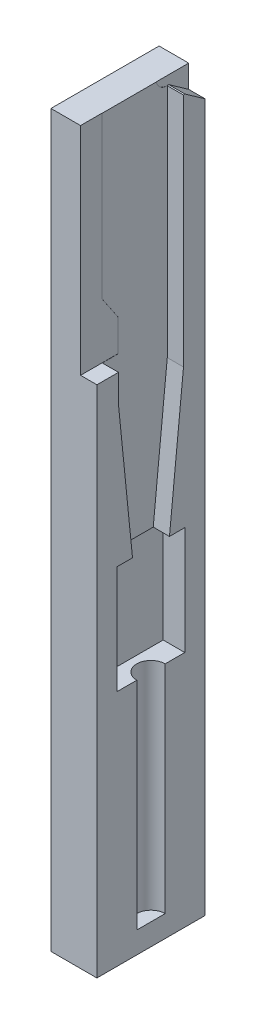
ISO-10303-21;
HEADER;
FILE_DESCRIPTION(('STEP AP214'),'2;1');
FILE_NAME('part.step','',(''),(''),'','','');
FILE_SCHEMA(('AUTOMOTIVE_DESIGN { 1 0 10303 214 1 1 1 1 }'));
ENDSEC;
DATA;
#1=APPLICATION_CONTEXT('core data for automotive mechanical design processes');
#2=APPLICATION_PROTOCOL_DEFINITION('international standard','automotive_design',2000,#1);
#3=PRODUCT_CONTEXT('',#1,'mechanical');
#4=PRODUCT('Part','Part','',(#3));
#5=PRODUCT_RELATED_PRODUCT_CATEGORY('part','',(#4));
#6=PRODUCT_DEFINITION_FORMATION('','',#4);
#7=PRODUCT_DEFINITION_CONTEXT('part definition',#1,'design');
#8=PRODUCT_DEFINITION('design','',#6,#7);
#9=PRODUCT_DEFINITION_SHAPE('','',#8);
#10=(LENGTH_UNIT() NAMED_UNIT(*) SI_UNIT(.MILLI.,.METRE.));
#11=(NAMED_UNIT(*) PLANE_ANGLE_UNIT() SI_UNIT($,.RADIAN.));
#12=(NAMED_UNIT(*) SI_UNIT($,.STERADIAN.) SOLID_ANGLE_UNIT());
#13=UNCERTAINTY_MEASURE_WITH_UNIT(LENGTH_MEASURE(1.E-05),#10,'distance_accuracy_value','');
#14=(GEOMETRIC_REPRESENTATION_CONTEXT(3) GLOBAL_UNCERTAINTY_ASSIGNED_CONTEXT((#13)) GLOBAL_UNIT_ASSIGNED_CONTEXT((#10,
#11,#12)) REPRESENTATION_CONTEXT('',''));
#15=CARTESIAN_POINT('',(0.,0.,0.));
#16=DIRECTION('',(0.,0.,1.));
#17=DIRECTION('',(1.,0.,0.));
#18=AXIS2_PLACEMENT_3D('',#15,#16,#17);
#19=CARTESIAN_POINT('',(-6.,0.,12.025));
#20=DIRECTION('',(0.,0.,1.));
#21=DIRECTION('',(0.,-1.,0.));
#22=AXIS2_PLACEMENT_3D('',#19,#20,#21);
#23=PLANE('',#22);
#24=DIRECTION('',(0.,-1.,0.));
#25=VECTOR('',#24,1.);
#26=CARTESIAN_POINT('',(-6.,0.,12.025));
#27=LINE('',#26,#25);
#28=CARTESIAN_POINT('',(-6.,-80.,12.025));
#29=VERTEX_POINT('',#28);
#30=CARTESIAN_POINT('',(-6.,-90.3197635039193,12.025));
#31=VERTEX_POINT('',#30);
#32=EDGE_CURVE('E309',#29,#31,#27,.T.);
#33=ORIENTED_EDGE('',*,*,#32,.F.);
#34=DIRECTION('',(1.,0.,0.));
#35=VECTOR('',#34,1.);
#36=CARTESIAN_POINT('',(-6.,-80.,12.025));
#37=LINE('',#36,#35);
#38=CARTESIAN_POINT('',(0.,-80.,12.025));
#39=VERTEX_POINT('',#38);
#40=EDGE_CURVE('E248',#29,#39,#37,.T.);
#41=ORIENTED_EDGE('',*,*,#40,.T.);
#42=DIRECTION('',(0.,1.,0.));
#43=VECTOR('',#42,1.);
#44=CARTESIAN_POINT('',(0.,0.,12.025));
#45=LINE('',#44,#43);
#46=CARTESIAN_POINT('',(0.,-90.3197635039193,12.025));
#47=VERTEX_POINT('',#46);
#48=EDGE_CURVE('E347',#47,#39,#45,.T.);
#49=ORIENTED_EDGE('',*,*,#48,.F.);
#50=DIRECTION('',(1.,0.,0.));
#51=VECTOR('',#50,1.);
#52=CARTESIAN_POINT('',(-6.,-90.3197635039193,12.025));
#53=LINE('',#52,#51);
#54=EDGE_CURVE('E321',#31,#47,#53,.T.);
#55=ORIENTED_EDGE('',*,*,#54,.F.);
#56=EDGE_LOOP('',(#33,#41,#49,#55));
#57=FACE_BOUND('',#56,.T.);
#58=ADVANCED_FACE('F33',(#57),#23,.F.);
#59=CARTESIAN_POINT('',(17.,0.,20.));
#60=DIRECTION('',(0.,-1.,0.));
#61=DIRECTION('',(0.,0.,-1.));
#62=AXIS2_PLACEMENT_3D('',#59,#60,#61);
#63=PLANE('',#62);
#64=DIRECTION('',(0.,0.,1.));
#65=VECTOR('',#64,1.);
#66=CARTESIAN_POINT('',(-6.,0.,-12.025));
#67=LINE('',#66,#65);
#68=CARTESIAN_POINT('',(-6.,0.,-7.96938060649105));
#69=VERTEX_POINT('',#68);
#70=CARTESIAN_POINT('',(-6.,0.,12.025));
#71=VERTEX_POINT('',#70);
#72=EDGE_CURVE('E307',#69,#71,#67,.T.);
#73=ORIENTED_EDGE('',*,*,#72,.F.);
#74=DIRECTION('',(1.,0.,0.));
#75=VECTOR('',#74,1.);
#76=CARTESIAN_POINT('',(-6.05,0.,-7.96938060649105));
#77=LINE('',#76,#75);
#78=CARTESIAN_POINT('',(-6.05,0.,-7.96938060649105));
#79=VERTEX_POINT('',#78);
#80=EDGE_CURVE('E219',#69,#79,#77,.F.);
#81=ORIENTED_EDGE('',*,*,#80,.T.);
#82=DIRECTION('',(0.,0.,1.));
#83=VECTOR('',#82,1.);
#84=CARTESIAN_POINT('',(-6.05,0.,20.));
#85=LINE('',#84,#83);
#86=CARTESIAN_POINT('',(-6.05,0.,-20.));
#87=VERTEX_POINT('',#86);
#88=EDGE_CURVE('E201',#87,#79,#85,.T.);
#89=ORIENTED_EDGE('',*,*,#88,.F.);
#90=DIRECTION('',(-1.,0.,0.));
#91=VECTOR('',#90,1.);
#92=CARTESIAN_POINT('',(17.,0.,-20.));
#93=LINE('',#92,#91);
#94=CARTESIAN_POINT('',(-17.,0.,-20.));
#95=VERTEX_POINT('',#94);
#96=EDGE_CURVE('E345',#87,#95,#93,.T.);
#97=ORIENTED_EDGE('',*,*,#96,.T.);
#98=DIRECTION('',(0.,0.,1.));
#99=VECTOR('',#98,1.);
#100=CARTESIAN_POINT('',(-17.,0.,20.));
#101=LINE('',#100,#99);
#102=CARTESIAN_POINT('',(-17.,0.,20.));
#103=VERTEX_POINT('',#102);
#104=EDGE_CURVE('E330',#95,#103,#101,.T.);
#105=ORIENTED_EDGE('',*,*,#104,.T.);
#106=DIRECTION('',(-1.,0.,0.));
#107=VECTOR('',#106,1.);
#108=CARTESIAN_POINT('',(17.,0.,20.));
#109=LINE('',#108,#107);
#110=CARTESIAN_POINT('',(-6.05,0.,20.));
#111=VERTEX_POINT('',#110);
#112=EDGE_CURVE('E343',#111,#103,#109,.T.);
#113=ORIENTED_EDGE('',*,*,#112,.F.);
#114=DIRECTION('',(0.,0.,-1.));
#115=VECTOR('',#114,1.);
#116=CARTESIAN_POINT('',(-6.05,0.,20.));
#117=LINE('',#116,#115);
#118=CARTESIAN_POINT('',(-6.05,0.,12.025));
#119=VERTEX_POINT('',#118);
#120=EDGE_CURVE('E254',#111,#119,#117,.T.);
#121=ORIENTED_EDGE('',*,*,#120,.T.);
#122=DIRECTION('',(1.,0.,0.));
#123=VECTOR('',#122,1.);
#124=CARTESIAN_POINT('',(17.,0.,12.025));
#125=LINE('',#124,#123);
#126=EDGE_CURVE('E245',#119,#71,#125,.T.);
#127=ORIENTED_EDGE('',*,*,#126,.T.);
#128=EDGE_LOOP('',(#73,#81,#89,#97,#105,#113,#121,#127));
#129=FACE_BOUND('',#128,.T.);
#130=ADVANCED_FACE('F396',(#129),#63,.F.);
#131=CARTESIAN_POINT('',(17.,-270.,-20.));
#132=DIRECTION('',(0.,0.,1.));
#133=DIRECTION('',(0.,-1.,0.));
#134=AXIS2_PLACEMENT_3D('',#131,#132,#133);
#135=PLANE('',#134);
#136=DIRECTION('',(0.,1.,0.));
#137=VECTOR('',#136,1.);
#138=CARTESIAN_POINT('',(-6.05,-270.,-20.));
#139=LINE('',#138,#137);
#140=CARTESIAN_POINT('',(-6.05,-8.4090427203815,-20.));
#141=VERTEX_POINT('',#140);
#142=EDGE_CURVE('E11',#141,#87,#139,.T.);
#143=ORIENTED_EDGE('',*,*,#142,.F.);
#144=DIRECTION('',(1.,0.,0.));
#145=VECTOR('',#144,1.);
#146=CARTESIAN_POINT('',(17.,-8.40904272038145,-20.));
#147=LINE('',#146,#145);
#148=CARTESIAN_POINT('',(0.,-8.40904272038149,-20.));
#149=VERTEX_POINT('',#148);
#150=EDGE_CURVE('E213',#141,#149,#147,.T.);
#151=ORIENTED_EDGE('',*,*,#150,.T.);
#152=DIRECTION('',(0.,1.,0.));
#153=VECTOR('',#152,1.);
#154=CARTESIAN_POINT('',(0.,-270.,-20.));
#155=LINE('',#154,#153);
#156=CARTESIAN_POINT('',(0.,-270.,-20.));
#157=VERTEX_POINT('',#156);
#158=EDGE_CURVE('E302',#157,#149,#155,.T.);
#159=ORIENTED_EDGE('',*,*,#158,.F.);
#160=DIRECTION('',(-1.,0.,0.));
#161=VECTOR('',#160,1.);
#162=CARTESIAN_POINT('',(17.,-270.,-20.));
#163=LINE('',#162,#161);
#164=CARTESIAN_POINT('',(-17.,-270.,-20.));
#165=VERTEX_POINT('',#164);
#166=EDGE_CURVE('E339',#157,#165,#163,.T.);
#167=ORIENTED_EDGE('',*,*,#166,.T.);
#168=DIRECTION('',(0.,1.,0.));
#169=VECTOR('',#168,1.);
#170=CARTESIAN_POINT('',(-17.,-270.,-20.));
#171=LINE('',#170,#169);
#172=EDGE_CURVE('E325',#165,#95,#171,.T.);
#173=ORIENTED_EDGE('',*,*,#172,.T.);
#174=ORIENTED_EDGE('',*,*,#96,.F.);
#175=EDGE_LOOP('',(#143,#151,#159,#167,#173,#174));
#176=FACE_BOUND('',#175,.T.);
#177=ADVANCED_FACE('F35',(#176),#135,.F.);
#178=CARTESIAN_POINT('',(17.,-270.,20.));
#179=DIRECTION('',(0.,0.,-1.));
#180=DIRECTION('',(0.,1.,0.));
#181=AXIS2_PLACEMENT_3D('',#178,#179,#180);
#182=PLANE('',#181);
#183=DIRECTION('',(0.,-1.,0.));
#184=VECTOR('',#183,1.);
#185=CARTESIAN_POINT('',(0.,-270.,20.));
#186=LINE('',#185,#184);
#187=CARTESIAN_POINT('',(0.,-80.,20.));
#188=VERTEX_POINT('',#187);
#189=CARTESIAN_POINT('',(0.,-270.,20.));
#190=VERTEX_POINT('',#189);
#191=EDGE_CURVE('E300',#188,#190,#186,.T.);
#192=ORIENTED_EDGE('',*,*,#191,.F.);
#193=DIRECTION('',(-1.,0.,0.));
#194=VECTOR('',#193,1.);
#195=CARTESIAN_POINT('',(17.,-80.,20.));
#196=LINE('',#195,#194);
#197=CARTESIAN_POINT('',(-6.05,-80.,20.));
#198=VERTEX_POINT('',#197);
#199=EDGE_CURVE('E56',#188,#198,#196,.T.);
#200=ORIENTED_EDGE('',*,*,#199,.T.);
#201=DIRECTION('',(0.,1.,0.));
#202=VECTOR('',#201,1.);
#203=CARTESIAN_POINT('',(-6.05,-270.,20.));
#204=LINE('',#203,#202);
#205=EDGE_CURVE('E371',#198,#111,#204,.T.);
#206=ORIENTED_EDGE('',*,*,#205,.T.);
#207=ORIENTED_EDGE('',*,*,#112,.T.);
#208=DIRECTION('',(0.,-1.,0.));
#209=VECTOR('',#208,1.);
#210=CARTESIAN_POINT('',(-17.,-270.,20.));
#211=LINE('',#210,#209);
#212=CARTESIAN_POINT('',(-17.,-270.,20.));
#213=VERTEX_POINT('',#212);
#214=EDGE_CURVE('E333',#103,#213,#211,.T.);
#215=ORIENTED_EDGE('',*,*,#214,.T.);
#216=DIRECTION('',(-1.,0.,0.));
#217=VECTOR('',#216,1.);
#218=CARTESIAN_POINT('',(17.,-270.,20.));
#219=LINE('',#218,#217);
#220=EDGE_CURVE('E341',#190,#213,#219,.T.);
#221=ORIENTED_EDGE('',*,*,#220,.F.);
#222=EDGE_LOOP('',(#192,#200,#206,#207,#215,#221));
#223=FACE_BOUND('',#222,.T.);
#224=ADVANCED_FACE('F386',(#223),#182,.F.);
#225=CARTESIAN_POINT('',(17.,-270.,20.));
#226=DIRECTION('',(0.,1.,0.));
#227=DIRECTION('',(0.,0.,1.));
#228=AXIS2_PLACEMENT_3D('',#225,#226,#227);
#229=PLANE('',#228);
#230=DIRECTION('',(0.,0.,-1.));
#231=VECTOR('',#230,1.);
#232=CARTESIAN_POINT('',(0.,-270.,20.));
#233=LINE('',#232,#231);
#234=EDGE_CURVE('E305',#190,#157,#233,.T.);
#235=ORIENTED_EDGE('',*,*,#234,.F.);
#236=ORIENTED_EDGE('',*,*,#220,.T.);
#237=DIRECTION('',(0.,0.,-1.));
#238=VECTOR('',#237,1.);
#239=CARTESIAN_POINT('',(-17.,-270.,20.));
#240=LINE('',#239,#238);
#241=EDGE_CURVE('E336',#213,#165,#240,.T.);
#242=ORIENTED_EDGE('',*,*,#241,.T.);
#243=ORIENTED_EDGE('',*,*,#166,.F.);
#244=EDGE_LOOP('',(#235,#236,#242,#243));
#245=FACE_BOUND('',#244,.T.);
#246=ADVANCED_FACE('F384',(#245),#229,.F.);
#247=CARTESIAN_POINT('',(-6.,0.,-12.025));
#248=DIRECTION('',(0.,0.,-1.));
#249=DIRECTION('',(0.,1.,0.));
#250=AXIS2_PLACEMENT_3D('',#247,#248,#249);
#251=PLANE('',#250);
#252=DIRECTION('',(0.,-1.,0.));
#253=VECTOR('',#252,1.);
#254=CARTESIAN_POINT('',(0.,0.,-12.025));
#255=LINE('',#254,#253);
#256=CARTESIAN_POINT('',(0.,-3.22134562528479,-12.025));
#257=VERTEX_POINT('',#256);
#258=CARTESIAN_POINT('',(0.,-90.3197635039193,-12.025));
#259=VERTEX_POINT('',#258);
#260=EDGE_CURVE('E298',#257,#259,#255,.T.);
#261=ORIENTED_EDGE('',*,*,#260,.F.);
#262=DIRECTION('',(1.,0.,0.));
#263=VECTOR('',#262,1.);
#264=CARTESIAN_POINT('',(-6.05,-3.22134562528479,-12.025));
#265=LINE('',#264,#263);
#266=CARTESIAN_POINT('',(-6.,-3.22134562528479,-12.025));
#267=VERTEX_POINT('',#266);
#268=EDGE_CURVE('E48',#257,#267,#265,.F.);
#269=ORIENTED_EDGE('',*,*,#268,.T.);
#270=DIRECTION('',(0.,1.,0.));
#271=VECTOR('',#270,1.);
#272=CARTESIAN_POINT('',(-6.,0.,-12.025));
#273=LINE('',#272,#271);
#274=CARTESIAN_POINT('',(-6.,-90.3197635039193,-12.025));
#275=VERTEX_POINT('',#274);
#276=EDGE_CURVE('E318',#275,#267,#273,.T.);
#277=ORIENTED_EDGE('',*,*,#276,.F.);
#278=DIRECTION('',(1.,0.,0.));
#279=VECTOR('',#278,1.);
#280=CARTESIAN_POINT('',(-6.,-90.3197635039193,-12.025));
#281=LINE('',#280,#279);
#282=EDGE_CURVE('E322',#275,#259,#281,.T.);
#283=ORIENTED_EDGE('',*,*,#282,.T.);
#284=EDGE_LOOP('',(#261,#269,#277,#283));
#285=FACE_BOUND('',#284,.T.);
#286=ADVANCED_FACE('F407',(#285),#251,.F.);
#287=CARTESIAN_POINT('',(-6.,-90.3197635039193,-12.025));
#288=DIRECTION('',(0.,-0.0999141874759714,-0.994996057851998));
#289=DIRECTION('',(0.,0.994996057851998,-0.0999141874759714));
#290=AXIS2_PLACEMENT_3D('',#287,#288,#289);
#291=PLANE('',#290);
#292=DIRECTION('',(0.,0.994996057851998,-0.0999141874759713));
#293=VECTOR('',#292,1.);
#294=CARTESIAN_POINT('',(-6.,-90.3197635039193,-12.025));
#295=LINE('',#294,#293);
#296=CARTESIAN_POINT('',(-6.,-142.,-6.83544291851858));
#297=VERTEX_POINT('',#296);
#298=EDGE_CURVE('E316',#297,#275,#295,.T.);
#299=ORIENTED_EDGE('',*,*,#298,.F.);
#300=DIRECTION('',(1.,0.,0.));
#301=VECTOR('',#300,1.);
#302=CARTESIAN_POINT('',(-6.,-142.,-6.83544291851858));
#303=LINE('',#302,#301);
#304=CARTESIAN_POINT('',(0.,-142.,-6.83544291851858));
#305=VERTEX_POINT('',#304);
#306=EDGE_CURVE('E290',#297,#305,#303,.T.);
#307=ORIENTED_EDGE('',*,*,#306,.T.);
#308=DIRECTION('',(0.,-0.994996057851998,0.0999141874759714));
#309=VECTOR('',#308,1.);
#310=CARTESIAN_POINT('',(0.,-90.3197635039193,-12.025));
#311=LINE('',#310,#309);
#312=EDGE_CURVE('E295',#259,#305,#311,.T.);
#313=ORIENTED_EDGE('',*,*,#312,.F.);
#314=ORIENTED_EDGE('',*,*,#282,.F.);
#315=EDGE_LOOP('',(#299,#307,#313,#314));
#316=FACE_BOUND('',#315,.T.);
#317=ADVANCED_FACE('F411',(#316),#291,.F.);
#318=CARTESIAN_POINT('',(-6.,-90.3197635039193,12.025));
#319=DIRECTION('',(0.,-0.0999141874759716,0.994996057851998));
#320=DIRECTION('',(0.,-0.994996057851998,-0.0999141874759716));
#321=AXIS2_PLACEMENT_3D('',#318,#319,#320);
#322=PLANE('',#321);
#323=DIRECTION('',(0.,0.994996057851998,0.0999141874759716));
#324=VECTOR('',#323,1.);
#325=CARTESIAN_POINT('',(0.,-90.3197635039193,12.025));
#326=LINE('',#325,#324);
#327=CARTESIAN_POINT('',(0.,-142.,6.83544291851855));
#328=VERTEX_POINT('',#327);
#329=EDGE_CURVE('E293',#328,#47,#326,.T.);
#330=ORIENTED_EDGE('',*,*,#329,.F.);
#331=DIRECTION('',(-1.,0.,0.));
#332=VECTOR('',#331,1.);
#333=CARTESIAN_POINT('',(-6.,-142.,6.83544291851855));
#334=LINE('',#333,#332);
#335=CARTESIAN_POINT('',(-6.,-142.,6.83544291851855));
#336=VERTEX_POINT('',#335);
#337=EDGE_CURVE('E284',#328,#336,#334,.T.);
#338=ORIENTED_EDGE('',*,*,#337,.T.);
#339=DIRECTION('',(0.,-0.994996057851998,-0.0999141874759716));
#340=VECTOR('',#339,1.);
#341=CARTESIAN_POINT('',(-6.,-90.3197635039193,12.025));
#342=LINE('',#341,#340);
#343=EDGE_CURVE('E313',#31,#336,#342,.T.);
#344=ORIENTED_EDGE('',*,*,#343,.F.);
#345=ORIENTED_EDGE('',*,*,#54,.T.);
#346=EDGE_LOOP('',(#330,#338,#344,#345));
#347=FACE_BOUND('',#346,.T.);
#348=ADVANCED_FACE('F421',(#347),#322,.F.);
#349=CARTESIAN_POINT('',(-17.,0.,0.));
#350=DIRECTION('',(-1.,0.,0.));
#351=DIRECTION('',(0.,0.,1.));
#352=AXIS2_PLACEMENT_3D('',#349,#350,#351);
#353=PLANE('',#352);
#354=ORIENTED_EDGE('',*,*,#172,.F.);
#355=ORIENTED_EDGE('',*,*,#241,.F.);
#356=ORIENTED_EDGE('',*,*,#214,.F.);
#357=ORIENTED_EDGE('',*,*,#104,.F.);
#358=EDGE_LOOP('',(#354,#355,#356,#357));
#359=FACE_BOUND('',#358,.T.);
#360=ADVANCED_FACE('F393',(#359),#353,.T.);
#361=CARTESIAN_POINT('',(-6.,0.,0.));
#362=DIRECTION('',(1.,0.,0.));
#363=DIRECTION('',(0.,0.,-1.));
#364=AXIS2_PLACEMENT_3D('',#361,#362,#363);
#365=PLANE('',#364);
#366=CARTESIAN_POINT('',(-6.,0.835620427681776,-11.9402612039554));
#367=DIRECTION('',(1.,0.,0.));
#368=DIRECTION('',(0.,0.,-1.));
#369=AXIS2_PLACEMENT_3D('',#366,#367,#368);
#370=CIRCLE('',#369,4.05785093596083);
#371=EDGE_CURVE('E217',#69,#267,#370,.T.);
#372=ORIENTED_EDGE('',*,*,#371,.F.);
#373=ORIENTED_EDGE('',*,*,#72,.T.);
#374=CARTESIAN_POINT('',(-6.,-59.5336356085458,12.025));
#375=VERTEX_POINT('',#374);
#376=EDGE_CURVE('E310',#71,#375,#27,.T.);
#377=ORIENTED_EDGE('',*,*,#376,.T.);
#378=DIRECTION('',(0.,0.829839719860912,0.558001827363642));
#379=VECTOR('',#378,1.);
#380=CARTESIAN_POINT('',(-6.,-24.1049535902313,35.8479971814537));
#381=LINE('',#380,#379);
#382=CARTESIAN_POINT('',(-6.,-68.2620050455538,6.15585927415993));
#383=VERTEX_POINT('',#382);
#384=EDGE_CURVE('E238',#383,#375,#381,.T.);
#385=ORIENTED_EDGE('',*,*,#384,.F.);
#386=DIRECTION('',(0.,1.,0.));
#387=VECTOR('',#386,1.);
#388=CARTESIAN_POINT('',(-6.,0.,6.15585927415994));
#389=LINE('',#388,#387);
#390=CARTESIAN_POINT('',(-6.,-80.,6.15585927415993));
#391=VERTEX_POINT('',#390);
#392=EDGE_CURVE('E369',#391,#383,#389,.T.);
#393=ORIENTED_EDGE('',*,*,#392,.F.);
#394=DIRECTION('',(0.,0.,-1.));
#395=VECTOR('',#394,1.);
#396=CARTESIAN_POINT('',(-6.,-80.,0.));
#397=LINE('',#396,#395);
#398=EDGE_CURVE('E252',#29,#391,#397,.T.);
#399=ORIENTED_EDGE('',*,*,#398,.F.);
#400=ORIENTED_EDGE('',*,*,#32,.T.);
#401=ORIENTED_EDGE('',*,*,#343,.T.);
#402=DIRECTION('',(0.,0.,1.));
#403=VECTOR('',#402,1.);
#404=CARTESIAN_POINT('',(-6.,-142.,0.));
#405=LINE('',#404,#403);
#406=EDGE_CURVE('E288',#297,#336,#405,.T.);
#407=ORIENTED_EDGE('',*,*,#406,.F.);
#408=ORIENTED_EDGE('',*,*,#298,.T.);
#409=ORIENTED_EDGE('',*,*,#276,.T.);
#410=EDGE_LOOP('',(#372,#373,#377,#385,#393,#399,#400,#401,#407,#408,#409));
#411=FACE_BOUND('',#410,.T.);
#412=ADVANCED_FACE('F399',(#411),#365,.T.);
#413=CARTESIAN_POINT('',(0.,0.,0.));
#414=DIRECTION('',(1.,0.,0.));
#415=DIRECTION('',(0.,0.,-1.));
#416=AXIS2_PLACEMENT_3D('',#413,#414,#415);
#417=PLANE('',#416);
#418=DIRECTION('',(0.,-0.576448215645926,-0.817133682256844));
#419=VECTOR('',#418,1.);
#420=CARTESIAN_POINT('',(0.,3.80592455051307,-2.6848953404624));
#421=LINE('',#420,#419);
#422=CARTESIAN_POINT('',(0.,-3.17205653715321,-12.5764054989147));
#423=VERTEX_POINT('',#422);
#424=EDGE_CURVE('E41',#423,#149,#421,.T.);
#425=ORIENTED_EDGE('',*,*,#424,.F.);
#426=CARTESIAN_POINT('',(0.,0.835620427681776,-11.9402612039554));
#427=DIRECTION('',(1.,0.,0.));
#428=DIRECTION('',(0.,0.,-1.));
#429=AXIS2_PLACEMENT_3D('',#426,#427,#428);
#430=CIRCLE('',#429,4.05785093596083);
#431=EDGE_CURVE('E207',#257,#423,#430,.T.);
#432=ORIENTED_EDGE('',*,*,#431,.F.);
#433=ORIENTED_EDGE('',*,*,#260,.T.);
#434=ORIENTED_EDGE('',*,*,#312,.T.);
#435=DIRECTION('',(0.,0.,1.));
#436=VECTOR('',#435,1.);
#437=CARTESIAN_POINT('',(0.,-142.,0.));
#438=LINE('',#437,#436);
#439=CARTESIAN_POINT('',(0.,-142.,-12.5));
#440=VERTEX_POINT('',#439);
#441=EDGE_CURVE('E353',#440,#305,#438,.T.);
#442=ORIENTED_EDGE('',*,*,#441,.F.);
#443=DIRECTION('',(0.,1.,0.));
#444=VECTOR('',#443,1.);
#445=CARTESIAN_POINT('',(0.,0.,-12.5));
#446=LINE('',#445,#444);
#447=CARTESIAN_POINT('',(0.,-182.,-12.5));
#448=VERTEX_POINT('',#447);
#449=EDGE_CURVE('E360',#448,#440,#446,.T.);
#450=ORIENTED_EDGE('',*,*,#449,.F.);
#451=DIRECTION('',(0.,0.,1.));
#452=VECTOR('',#451,1.);
#453=CARTESIAN_POINT('',(0.,-182.,0.));
#454=LINE('',#453,#452);
#455=CARTESIAN_POINT('',(0.,-182.,-5.25));
#456=VERTEX_POINT('',#455);
#457=EDGE_CURVE('E357',#448,#456,#454,.T.);
#458=ORIENTED_EDGE('',*,*,#457,.T.);
#459=DIRECTION('',(0.,1.,0.));
#460=VECTOR('',#459,1.);
#461=CARTESIAN_POINT('',(0.,-262.,-5.25));
#462=LINE('',#461,#460);
#463=CARTESIAN_POINT('',(0.,-262.,-5.25));
#464=VERTEX_POINT('',#463);
#465=EDGE_CURVE('E262',#464,#456,#462,.T.);
#466=ORIENTED_EDGE('',*,*,#465,.F.);
#467=DIRECTION('',(0.,0.,1.));
#468=VECTOR('',#467,1.);
#469=CARTESIAN_POINT('',(0.,-262.,0.));
#470=LINE('',#469,#468);
#471=CARTESIAN_POINT('',(0.,-262.,5.25));
#472=VERTEX_POINT('',#471);
#473=EDGE_CURVE('E364',#464,#472,#470,.T.);
#474=ORIENTED_EDGE('',*,*,#473,.T.);
#475=DIRECTION('',(0.,1.,0.));
#476=VECTOR('',#475,1.);
#477=CARTESIAN_POINT('',(0.,-262.,5.25));
#478=LINE('',#477,#476);
#479=CARTESIAN_POINT('',(0.,-182.,5.25));
#480=VERTEX_POINT('',#479);
#481=EDGE_CURVE('E260',#480,#472,#478,.F.);
#482=ORIENTED_EDGE('',*,*,#481,.F.);
#483=CARTESIAN_POINT('',(0.,-182.,12.5));
#484=VERTEX_POINT('',#483);
#485=EDGE_CURVE('E356',#480,#484,#454,.T.);
#486=ORIENTED_EDGE('',*,*,#485,.T.);
#487=DIRECTION('',(0.,-1.,0.));
#488=VECTOR('',#487,1.);
#489=CARTESIAN_POINT('',(0.,0.,12.5));
#490=LINE('',#489,#488);
#491=CARTESIAN_POINT('',(0.,-142.,12.5));
#492=VERTEX_POINT('',#491);
#493=EDGE_CURVE('E352',#492,#484,#490,.T.);
#494=ORIENTED_EDGE('',*,*,#493,.F.);
#495=EDGE_CURVE('E350',#328,#492,#438,.T.);
#496=ORIENTED_EDGE('',*,*,#495,.F.);
#497=ORIENTED_EDGE('',*,*,#329,.T.);
#498=ORIENTED_EDGE('',*,*,#48,.T.);
#499=DIRECTION('',(0.,0.,-1.));
#500=VECTOR('',#499,1.);
#501=CARTESIAN_POINT('',(0.,-80.,0.));
#502=LINE('',#501,#500);
#503=EDGE_CURVE('E367',#188,#39,#502,.T.);
#504=ORIENTED_EDGE('',*,*,#503,.F.);
#505=ORIENTED_EDGE('',*,*,#191,.T.);
#506=ORIENTED_EDGE('',*,*,#234,.T.);
#507=ORIENTED_EDGE('',*,*,#158,.T.);
#508=EDGE_LOOP('',(#425,#432,#433,#434,#442,#450,#458,#466,#474,#482,#486,#494,#496,#497,#498,
#504,#505,#506,#507));
#509=FACE_BOUND('',#508,.T.);
#510=ADVANCED_FACE('F379',(#509),#417,.T.);
#511=CARTESIAN_POINT('',(-8.,-182.,12.5));
#512=DIRECTION('',(-1.,0.,0.));
#513=DIRECTION('',(0.,0.,1.));
#514=AXIS2_PLACEMENT_3D('',#511,#512,#513);
#515=PLANE('',#514);
#516=DIRECTION('',(0.,0.,1.));
#517=VECTOR('',#516,1.);
#518=CARTESIAN_POINT('',(-8.,-142.,12.5));
#519=LINE('',#518,#517);
#520=CARTESIAN_POINT('',(-8.,-142.,-12.5));
#521=VERTEX_POINT('',#520);
#522=CARTESIAN_POINT('',(-8.,-142.,12.5));
#523=VERTEX_POINT('',#522);
#524=EDGE_CURVE('E264',#521,#523,#519,.T.);
#525=ORIENTED_EDGE('',*,*,#524,.T.);
#526=DIRECTION('',(0.,1.,0.));
#527=VECTOR('',#526,1.);
#528=CARTESIAN_POINT('',(-8.,-182.,12.5));
#529=LINE('',#528,#527);
#530=CARTESIAN_POINT('',(-8.,-182.,12.5));
#531=VERTEX_POINT('',#530);
#532=EDGE_CURVE('E274',#531,#523,#529,.T.);
#533=ORIENTED_EDGE('',*,*,#532,.F.);
#534=DIRECTION('',(0.,0.,1.));
#535=VECTOR('',#534,1.);
#536=CARTESIAN_POINT('',(-8.,-182.,12.5));
#537=LINE('',#536,#535);
#538=CARTESIAN_POINT('',(-8.,-182.,-12.5));
#539=VERTEX_POINT('',#538);
#540=EDGE_CURVE('E265',#539,#531,#537,.T.);
#541=ORIENTED_EDGE('',*,*,#540,.F.);
#542=DIRECTION('',(0.,1.,0.));
#543=VECTOR('',#542,1.);
#544=CARTESIAN_POINT('',(-8.,-182.,-12.5));
#545=LINE('',#544,#543);
#546=EDGE_CURVE('E281',#539,#521,#545,.T.);
#547=ORIENTED_EDGE('',*,*,#546,.T.);
#548=EDGE_LOOP('',(#525,#533,#541,#547));
#549=FACE_BOUND('',#548,.T.);
#550=ADVANCED_FACE('F438',(#549),#515,.F.);
#551=CARTESIAN_POINT('',(8.,-182.,-12.5));
#552=DIRECTION('',(0.,0.,-1.));
#553=DIRECTION('',(-1.,0.,0.));
#554=AXIS2_PLACEMENT_3D('',#551,#552,#553);
#555=PLANE('',#554);
#556=ORIENTED_EDGE('',*,*,#449,.T.);
#557=DIRECTION('',(-1.,0.,0.));
#558=VECTOR('',#557,1.);
#559=CARTESIAN_POINT('',(8.,-142.,-12.5));
#560=LINE('',#559,#558);
#561=EDGE_CURVE('E269',#440,#521,#560,.T.);
#562=ORIENTED_EDGE('',*,*,#561,.T.);
#563=ORIENTED_EDGE('',*,*,#546,.F.);
#564=DIRECTION('',(-1.,0.,0.));
#565=VECTOR('',#564,1.);
#566=CARTESIAN_POINT('',(8.,-182.,-12.5));
#567=LINE('',#566,#565);
#568=EDGE_CURVE('E272',#448,#539,#567,.T.);
#569=ORIENTED_EDGE('',*,*,#568,.F.);
#570=EDGE_LOOP('',(#556,#562,#563,#569));
#571=FACE_BOUND('',#570,.T.);
#572=ADVANCED_FACE('F443',(#571),#555,.F.);
#573=CARTESIAN_POINT('',(8.,-182.,12.5));
#574=DIRECTION('',(0.,0.,1.));
#575=DIRECTION('',(1.,0.,0.));
#576=AXIS2_PLACEMENT_3D('',#573,#574,#575);
#577=PLANE('',#576);
#578=ORIENTED_EDGE('',*,*,#493,.T.);
#579=DIRECTION('',(1.,0.,0.));
#580=VECTOR('',#579,1.);
#581=CARTESIAN_POINT('',(8.,-182.,12.5));
#582=LINE('',#581,#580);
#583=EDGE_CURVE('E268',#531,#484,#582,.T.);
#584=ORIENTED_EDGE('',*,*,#583,.F.);
#585=ORIENTED_EDGE('',*,*,#532,.T.);
#586=DIRECTION('',(1.,0.,0.));
#587=VECTOR('',#586,1.);
#588=CARTESIAN_POINT('',(8.,-142.,12.5));
#589=LINE('',#588,#587);
#590=EDGE_CURVE('E277',#523,#492,#589,.T.);
#591=ORIENTED_EDGE('',*,*,#590,.T.);
#592=EDGE_LOOP('',(#578,#584,#585,#591));
#593=FACE_BOUND('',#592,.T.);
#594=ADVANCED_FACE('F430',(#593),#577,.F.);
#595=CARTESIAN_POINT('',(0.,-182.,0.));
#596=DIRECTION('',(0.,1.,0.));
#597=DIRECTION('',(0.,0.,1.));
#598=AXIS2_PLACEMENT_3D('',#595,#596,#597);
#599=PLANE('',#598);
#600=CARTESIAN_POINT('',(0.,-182.,0.));
#601=DIRECTION('',(0.,1.,0.));
#602=DIRECTION('',(0.,0.,1.));
#603=AXIS2_PLACEMENT_3D('',#600,#601,#602);
#604=CIRCLE('',#603,5.25);
#605=EDGE_CURVE('E362',#456,#480,#604,.T.);
#606=ORIENTED_EDGE('',*,*,#605,.F.);
#607=ORIENTED_EDGE('',*,*,#457,.F.);
#608=ORIENTED_EDGE('',*,*,#568,.T.);
#609=ORIENTED_EDGE('',*,*,#540,.T.);
#610=ORIENTED_EDGE('',*,*,#583,.T.);
#611=ORIENTED_EDGE('',*,*,#485,.F.);
#612=EDGE_LOOP('',(#606,#607,#608,#609,#610,#611));
#613=FACE_BOUND('',#612,.T.);
#614=ADVANCED_FACE('F433',(#613),#599,.T.);
#615=CARTESIAN_POINT('',(0.,-142.,0.));
#616=DIRECTION('',(0.,1.,0.));
#617=DIRECTION('',(0.,0.,1.));
#618=AXIS2_PLACEMENT_3D('',#615,#616,#617);
#619=PLANE('',#618);
#620=ORIENTED_EDGE('',*,*,#441,.T.);
#621=ORIENTED_EDGE('',*,*,#306,.F.);
#622=ORIENTED_EDGE('',*,*,#406,.T.);
#623=ORIENTED_EDGE('',*,*,#337,.F.);
#624=ORIENTED_EDGE('',*,*,#495,.T.);
#625=ORIENTED_EDGE('',*,*,#590,.F.);
#626=ORIENTED_EDGE('',*,*,#524,.F.);
#627=ORIENTED_EDGE('',*,*,#561,.F.);
#628=EDGE_LOOP('',(#620,#621,#622,#623,#624,#625,#626,#627));
#629=FACE_BOUND('',#628,.T.);
#630=ADVANCED_FACE('F413',(#629),#619,.F.);
#631=CARTESIAN_POINT('',(0.,-262.,0.));
#632=DIRECTION('',(0.,1.,0.));
#633=DIRECTION('',(0.,0.,1.));
#634=AXIS2_PLACEMENT_3D('',#631,#632,#633);
#635=CYLINDRICAL_SURFACE('',#634,5.25);
#636=ORIENTED_EDGE('',*,*,#465,.T.);
#637=ORIENTED_EDGE('',*,*,#605,.T.);
#638=ORIENTED_EDGE('',*,*,#481,.T.);
#639=CARTESIAN_POINT('',(0.,-262.,0.));
#640=DIRECTION('',(0.,1.,0.));
#641=DIRECTION('',(0.,0.,1.));
#642=AXIS2_PLACEMENT_3D('',#639,#640,#641);
#643=CIRCLE('',#642,5.25);
#644=EDGE_CURVE('E257',#464,#472,#643,.T.);
#645=ORIENTED_EDGE('',*,*,#644,.F.);
#646=EDGE_LOOP('',(#636,#637,#638,#645));
#647=FACE_BOUND('',#646,.T.);
#648=ADVANCED_FACE('F493',(#647),#635,.F.);
#649=CARTESIAN_POINT('',(0.,-262.,0.));
#650=DIRECTION('',(0.,1.,0.));
#651=DIRECTION('',(0.,0.,1.));
#652=AXIS2_PLACEMENT_3D('',#649,#650,#651);
#653=PLANE('',#652);
#654=ORIENTED_EDGE('',*,*,#644,.T.);
#655=ORIENTED_EDGE('',*,*,#473,.F.);
#656=EDGE_LOOP('',(#654,#655));
#657=FACE_BOUND('',#656,.T.);
#658=ADVANCED_FACE('F488',(#657),#653,.T.);
#659=CARTESIAN_POINT('',(-6.05,0.,0.));
#660=DIRECTION('',(-1.,0.,0.));
#661=DIRECTION('',(0.,0.,1.));
#662=AXIS2_PLACEMENT_3D('',#659,#660,#661);
#663=PLANE('',#662);
#664=ORIENTED_EDGE('',*,*,#205,.F.);
#665=DIRECTION('',(0.,0.,-1.));
#666=VECTOR('',#665,1.);
#667=CARTESIAN_POINT('',(-6.05,-80.,6.15585927415993));
#668=LINE('',#667,#666);
#669=CARTESIAN_POINT('',(-6.05,-80.,6.15585927415993));
#670=VERTEX_POINT('',#669);
#671=EDGE_CURVE('E232',#198,#670,#668,.T.);
#672=ORIENTED_EDGE('',*,*,#671,.T.);
#673=DIRECTION('',(0.,1.,0.));
#674=VECTOR('',#673,1.);
#675=CARTESIAN_POINT('',(-6.05,-68.2620050455538,6.15585927415993));
#676=LINE('',#675,#674);
#677=CARTESIAN_POINT('',(-6.05,-68.2620050455538,6.15585927415993));
#678=VERTEX_POINT('',#677);
#679=EDGE_CURVE('E223',#670,#678,#676,.T.);
#680=ORIENTED_EDGE('',*,*,#679,.T.);
#681=DIRECTION('',(0.,0.829839719860912,0.558001827363642));
#682=VECTOR('',#681,1.);
#683=CARTESIAN_POINT('',(-6.05,-59.5336356085458,12.025));
#684=LINE('',#683,#682);
#685=CARTESIAN_POINT('',(-6.05,-59.5336356085458,12.025));
#686=VERTEX_POINT('',#685);
#687=EDGE_CURVE('E226',#678,#686,#684,.T.);
#688=ORIENTED_EDGE('',*,*,#687,.T.);
#689=DIRECTION('',(0.,1.,0.));
#690=VECTOR('',#689,1.);
#691=CARTESIAN_POINT('',(-6.05,2.04270401226912,12.025));
#692=LINE('',#691,#690);
#693=EDGE_CURVE('E229',#686,#119,#692,.T.);
#694=ORIENTED_EDGE('',*,*,#693,.T.);
#695=ORIENTED_EDGE('',*,*,#120,.F.);
#696=EDGE_LOOP('',(#664,#672,#680,#688,#694,#695));
#697=FACE_BOUND('',#696,.T.);
#698=ADVANCED_FACE('F492',(#697),#663,.F.);
#699=CARTESIAN_POINT('',(-6.05,2.04270401226912,12.025));
#700=DIRECTION('',(0.,0.,-1.));
#701=DIRECTION('',(0.,1.,0.));
#702=AXIS2_PLACEMENT_3D('',#699,#700,#701);
#703=PLANE('',#702);
#704=ORIENTED_EDGE('',*,*,#376,.F.);
#705=ORIENTED_EDGE('',*,*,#126,.F.);
#706=ORIENTED_EDGE('',*,*,#693,.F.);
#707=DIRECTION('',(1.,0.,0.));
#708=VECTOR('',#707,1.);
#709=CARTESIAN_POINT('',(-6.05,-59.5336356085458,12.025));
#710=LINE('',#709,#708);
#711=EDGE_CURVE('E239',#686,#375,#710,.T.);
#712=ORIENTED_EDGE('',*,*,#711,.T.);
#713=EDGE_LOOP('',(#704,#705,#706,#712));
#714=FACE_BOUND('',#713,.T.);
#715=ADVANCED_FACE('F591',(#714),#703,.F.);
#716=CARTESIAN_POINT('',(-6.05,-68.2620050455538,6.15585927415993));
#717=DIRECTION('',(0.,0.,-1.));
#718=DIRECTION('',(0.,1.,0.));
#719=AXIS2_PLACEMENT_3D('',#716,#717,#718);
#720=PLANE('',#719);
#721=ORIENTED_EDGE('',*,*,#392,.T.);
#722=DIRECTION('',(1.,0.,0.));
#723=VECTOR('',#722,1.);
#724=CARTESIAN_POINT('',(-6.05,-68.2620050455538,6.15585927415993));
#725=LINE('',#724,#723);
#726=EDGE_CURVE('E234',#678,#383,#725,.T.);
#727=ORIENTED_EDGE('',*,*,#726,.F.);
#728=ORIENTED_EDGE('',*,*,#679,.F.);
#729=DIRECTION('',(1.,0.,0.));
#730=VECTOR('',#729,1.);
#731=CARTESIAN_POINT('',(-6.05,-80.,6.15585927415993));
#732=LINE('',#731,#730);
#733=EDGE_CURVE('E235',#670,#391,#732,.T.);
#734=ORIENTED_EDGE('',*,*,#733,.T.);
#735=EDGE_LOOP('',(#721,#727,#728,#734));
#736=FACE_BOUND('',#735,.T.);
#737=ADVANCED_FACE('F601',(#736),#720,.F.);
#738=CARTESIAN_POINT('',(-6.05,-80.,6.15585927415993));
#739=DIRECTION('',(0.,-1.,0.));
#740=DIRECTION('',(0.,0.,-1.));
#741=AXIS2_PLACEMENT_3D('',#738,#739,#740);
#742=PLANE('',#741);
#743=ORIENTED_EDGE('',*,*,#398,.T.);
#744=ORIENTED_EDGE('',*,*,#733,.F.);
#745=ORIENTED_EDGE('',*,*,#671,.F.);
#746=ORIENTED_EDGE('',*,*,#199,.F.);
#747=ORIENTED_EDGE('',*,*,#503,.T.);
#748=ORIENTED_EDGE('',*,*,#40,.F.);
#749=EDGE_LOOP('',(#743,#744,#745,#746,#747,#748));
#750=FACE_BOUND('',#749,.T.);
#751=ADVANCED_FACE('F611',(#750),#742,.F.);
#752=CARTESIAN_POINT('',(-6.05,-59.5336356085458,12.025));
#753=DIRECTION('',(0.,0.558001827363642,-0.829839719860912));
#754=DIRECTION('',(0.,0.829839719860912,0.558001827363642));
#755=AXIS2_PLACEMENT_3D('',#752,#753,#754);
#756=PLANE('',#755);
#757=ORIENTED_EDGE('',*,*,#384,.T.);
#758=ORIENTED_EDGE('',*,*,#711,.F.);
#759=ORIENTED_EDGE('',*,*,#687,.F.);
#760=ORIENTED_EDGE('',*,*,#726,.T.);
#761=EDGE_LOOP('',(#757,#758,#759,#760));
#762=FACE_BOUND('',#761,.T.);
#763=ADVANCED_FACE('F621',(#762),#756,.F.);
#764=CARTESIAN_POINT('',(-6.05,0.835620427681776,-11.9402612039554));
#765=DIRECTION('',(1.,0.,0.));
#766=DIRECTION('',(0.,0.,-1.));
#767=AXIS2_PLACEMENT_3D('',#764,#765,#766);
#768=PLANE('',#767);
#769=ORIENTED_EDGE('',*,*,#88,.T.);
#770=CARTESIAN_POINT('',(-6.05,0.835620427681776,-11.9402612039554));
#771=DIRECTION('',(1.,0.,0.));
#772=DIRECTION('',(0.,0.,-1.));
#773=AXIS2_PLACEMENT_3D('',#770,#771,#772);
#774=CIRCLE('',#773,4.05785093596083);
#775=CARTESIAN_POINT('',(-6.05,-3.17205653715321,-12.5764054989147));
#776=VERTEX_POINT('',#775);
#777=EDGE_CURVE('E194',#79,#776,#774,.T.);
#778=ORIENTED_EDGE('',*,*,#777,.T.);
#779=DIRECTION('',(0.,-0.576448215645926,-0.817133682256844));
#780=VECTOR('',#779,1.);
#781=CARTESIAN_POINT('',(-6.05,-3.17205653715321,-12.5764054989147));
#782=LINE('',#781,#780);
#783=EDGE_CURVE('E198',#776,#141,#782,.T.);
#784=ORIENTED_EDGE('',*,*,#783,.T.);
#785=ORIENTED_EDGE('',*,*,#142,.T.);
#786=EDGE_LOOP('',(#769,#778,#784,#785));
#787=FACE_BOUND('',#786,.T.);
#788=ADVANCED_FACE('F196',(#787),#768,.T.);
#789=CARTESIAN_POINT('',(-6.05,-3.17205653715321,-12.5764054989147));
#790=DIRECTION('',(0.,-0.817133682256844,0.576448215645926));
#791=DIRECTION('',(0.,-0.576448215645926,-0.817133682256844));
#792=AXIS2_PLACEMENT_3D('',#789,#790,#791);
#793=PLANE('',#792);
#794=ORIENTED_EDGE('',*,*,#783,.F.);
#795=DIRECTION('',(1.,0.,0.));
#796=VECTOR('',#795,1.);
#797=CARTESIAN_POINT('',(-6.05,-3.17205653715321,-12.5764054989147));
#798=LINE('',#797,#796);
#799=EDGE_CURVE('E205',#776,#423,#798,.T.);
#800=ORIENTED_EDGE('',*,*,#799,.T.);
#801=ORIENTED_EDGE('',*,*,#424,.T.);
#802=ORIENTED_EDGE('',*,*,#150,.F.);
#803=EDGE_LOOP('',(#794,#800,#801,#802));
#804=FACE_BOUND('',#803,.T.);
#805=ADVANCED_FACE('F211',(#804),#793,.F.);
#806=CARTESIAN_POINT('',(-6.05,0.835620427681776,-11.9402612039554));
#807=DIRECTION('',(1.,0.,0.));
#808=DIRECTION('',(0.,0.,-1.));
#809=AXIS2_PLACEMENT_3D('',#806,#807,#808);
#810=CYLINDRICAL_SURFACE('',#809,4.05785093596083);
#811=ORIENTED_EDGE('',*,*,#371,.T.);
#812=ORIENTED_EDGE('',*,*,#268,.F.);
#813=ORIENTED_EDGE('',*,*,#431,.T.);
#814=ORIENTED_EDGE('',*,*,#799,.F.);
#815=ORIENTED_EDGE('',*,*,#777,.F.);
#816=ORIENTED_EDGE('',*,*,#80,.F.);
#817=EDGE_LOOP('',(#811,#812,#813,#814,#815,#816));
#818=FACE_BOUND('',#817,.T.);
#819=ADVANCED_FACE('F206',(#818),#810,.F.);
#820=CLOSED_SHELL('',(#58,#130,#177,#224,#246,#286,#317,#348,#360,#412,#510,#550,#572,#594,#614,
#630,#648,#658,#698,#715,#737,#751,#763,#788,#805,#819));
#821=MANIFOLD_SOLID_BREP('B2',#820);
#822=ADVANCED_BREP_SHAPE_REPRESENTATION('',(#18,#821),#14);
#823=SHAPE_DEFINITION_REPRESENTATION(#9,#822);
ENDSEC;
END-ISO-10303-21;
